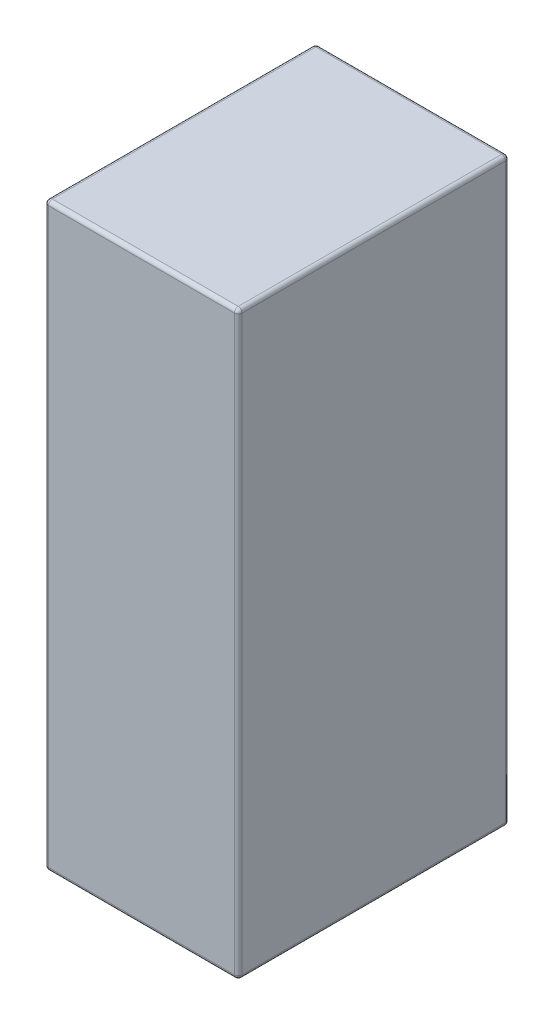
ISO-10303-21;
HEADER;
FILE_DESCRIPTION(('STEP AP214'),'2;1');
FILE_NAME('part.step','',(''),(''),'','','');
FILE_SCHEMA(('AUTOMOTIVE_DESIGN { 1 0 10303 214 1 1 1 1 }'));
ENDSEC;
DATA;
#1=APPLICATION_CONTEXT('core data for automotive mechanical design processes');
#2=APPLICATION_PROTOCOL_DEFINITION('international standard','automotive_design',2000,#1);
#3=PRODUCT_CONTEXT('',#1,'mechanical');
#4=PRODUCT('Part','Part','',(#3));
#5=PRODUCT_RELATED_PRODUCT_CATEGORY('part','',(#4));
#6=PRODUCT_DEFINITION_FORMATION('','',#4);
#7=PRODUCT_DEFINITION_CONTEXT('part definition',#1,'design');
#8=PRODUCT_DEFINITION('design','',#6,#7);
#9=PRODUCT_DEFINITION_SHAPE('','',#8);
#10=(LENGTH_UNIT() NAMED_UNIT(*) SI_UNIT(.MILLI.,.METRE.));
#11=(NAMED_UNIT(*) PLANE_ANGLE_UNIT() SI_UNIT($,.RADIAN.));
#12=(NAMED_UNIT(*) SI_UNIT($,.STERADIAN.) SOLID_ANGLE_UNIT());
#13=UNCERTAINTY_MEASURE_WITH_UNIT(LENGTH_MEASURE(1.E-05),#10,'distance_accuracy_value','');
#14=(GEOMETRIC_REPRESENTATION_CONTEXT(3) GLOBAL_UNCERTAINTY_ASSIGNED_CONTEXT((#13)) GLOBAL_UNIT_ASSIGNED_CONTEXT((#10,
#11,#12)) REPRESENTATION_CONTEXT('',''));
#15=CARTESIAN_POINT('',(0.,0.,0.));
#16=DIRECTION('',(0.,0.,1.));
#17=DIRECTION('',(1.,0.,0.));
#18=AXIS2_PLACEMENT_3D('',#15,#16,#17);
#19=CARTESIAN_POINT('',(25.,75.,35.));
#20=DIRECTION('',(-1.,0.,0.));
#21=DIRECTION('',(0.,0.,1.));
#22=AXIS2_PLACEMENT_3D('',#19,#20,#21);
#23=PLANE('',#22);
#24=DIRECTION('',(0.,-1.,0.));
#25=VECTOR('',#24,1.);
#26=CARTESIAN_POINT('',(25.,75.,34.));
#27=LINE('',#26,#25);
#28=CARTESIAN_POINT('',(25.,74.,34.));
#29=VERTEX_POINT('',#28);
#30=CARTESIAN_POINT('',(25.,-74.,34.));
#31=VERTEX_POINT('',#30);
#32=EDGE_CURVE('E165',#29,#31,#27,.T.);
#33=ORIENTED_EDGE('',*,*,#32,.T.);
#34=DIRECTION('',(0.,0.,-1.));
#35=VECTOR('',#34,1.);
#36=CARTESIAN_POINT('',(25.,-74.,-35.));
#37=LINE('',#36,#35);
#38=CARTESIAN_POINT('',(25.,-74.,-34.));
#39=VERTEX_POINT('',#38);
#40=EDGE_CURVE('E170',#31,#39,#37,.T.);
#41=ORIENTED_EDGE('',*,*,#40,.T.);
#42=DIRECTION('',(0.,-1.,0.));
#43=VECTOR('',#42,1.);
#44=CARTESIAN_POINT('',(25.,75.,-34.));
#45=LINE('',#44,#43);
#46=CARTESIAN_POINT('',(25.,74.,-34.));
#47=VERTEX_POINT('',#46);
#48=EDGE_CURVE('E167',#39,#47,#45,.F.);
#49=ORIENTED_EDGE('',*,*,#48,.T.);
#50=DIRECTION('',(0.,0.,-1.));
#51=VECTOR('',#50,1.);
#52=CARTESIAN_POINT('',(25.,74.,35.));
#53=LINE('',#52,#51);
#54=EDGE_CURVE('E163',#47,#29,#53,.F.);
#55=ORIENTED_EDGE('',*,*,#54,.T.);
#56=EDGE_LOOP('',(#33,#41,#49,#55));
#57=FACE_BOUND('',#56,.T.);
#58=ADVANCED_FACE('F32',(#57),#23,.F.);
#59=CARTESIAN_POINT('',(-25.,75.,-35.));
#60=DIRECTION('',(0.,0.,1.));
#61=DIRECTION('',(1.,0.,0.));
#62=AXIS2_PLACEMENT_3D('',#59,#60,#61);
#63=PLANE('',#62);
#64=DIRECTION('',(0.,-1.,0.));
#65=VECTOR('',#64,1.);
#66=CARTESIAN_POINT('',(24.,75.,-35.));
#67=LINE('',#66,#65);
#68=CARTESIAN_POINT('',(24.,74.,-35.));
#69=VERTEX_POINT('',#68);
#70=CARTESIAN_POINT('',(24.,-74.,-35.));
#71=VERTEX_POINT('',#70);
#72=EDGE_CURVE('E131',#69,#71,#67,.T.);
#73=ORIENTED_EDGE('',*,*,#72,.T.);
#74=DIRECTION('',(-1.,0.,0.));
#75=VECTOR('',#74,1.);
#76=CARTESIAN_POINT('',(-25.,-74.,-35.));
#77=LINE('',#76,#75);
#78=CARTESIAN_POINT('',(-24.,-74.,-35.));
#79=VERTEX_POINT('',#78);
#80=EDGE_CURVE('E127',#71,#79,#77,.T.);
#81=ORIENTED_EDGE('',*,*,#80,.T.);
#82=DIRECTION('',(0.,-1.,0.));
#83=VECTOR('',#82,1.);
#84=CARTESIAN_POINT('',(-24.,75.,-35.));
#85=LINE('',#84,#83);
#86=CARTESIAN_POINT('',(-24.,74.,-35.));
#87=VERTEX_POINT('',#86);
#88=EDGE_CURVE('E119',#79,#87,#85,.F.);
#89=ORIENTED_EDGE('',*,*,#88,.T.);
#90=DIRECTION('',(-1.,0.,0.));
#91=VECTOR('',#90,1.);
#92=CARTESIAN_POINT('',(-25.,74.,-35.));
#93=LINE('',#92,#91);
#94=EDGE_CURVE('E124',#87,#69,#93,.F.);
#95=ORIENTED_EDGE('',*,*,#94,.T.);
#96=EDGE_LOOP('',(#73,#81,#89,#95));
#97=FACE_BOUND('',#96,.T.);
#98=ADVANCED_FACE('F122',(#97),#63,.F.);
#99=CARTESIAN_POINT('',(-25.,75.,35.));
#100=DIRECTION('',(1.,0.,0.));
#101=DIRECTION('',(0.,0.,-1.));
#102=AXIS2_PLACEMENT_3D('',#99,#100,#101);
#103=PLANE('',#102);
#104=DIRECTION('',(0.,-1.,0.));
#105=VECTOR('',#104,1.);
#106=CARTESIAN_POINT('',(-25.,75.,-34.));
#107=LINE('',#106,#105);
#108=CARTESIAN_POINT('',(-25.,74.,-34.));
#109=VERTEX_POINT('',#108);
#110=CARTESIAN_POINT('',(-25.,-74.,-34.));
#111=VERTEX_POINT('',#110);
#112=EDGE_CURVE('E139',#109,#111,#107,.T.);
#113=ORIENTED_EDGE('',*,*,#112,.T.);
#114=DIRECTION('',(0.,0.,1.));
#115=VECTOR('',#114,1.);
#116=CARTESIAN_POINT('',(-25.,-74.,35.));
#117=LINE('',#116,#115);
#118=CARTESIAN_POINT('',(-25.,-74.,34.));
#119=VERTEX_POINT('',#118);
#120=EDGE_CURVE('E177',#111,#119,#117,.T.);
#121=ORIENTED_EDGE('',*,*,#120,.T.);
#122=DIRECTION('',(0.,-1.,0.));
#123=VECTOR('',#122,1.);
#124=CARTESIAN_POINT('',(-25.,75.,34.));
#125=LINE('',#124,#123);
#126=CARTESIAN_POINT('',(-25.,74.,34.));
#127=VERTEX_POINT('',#126);
#128=EDGE_CURVE('E174',#119,#127,#125,.F.);
#129=ORIENTED_EDGE('',*,*,#128,.T.);
#130=DIRECTION('',(0.,0.,1.));
#131=VECTOR('',#130,1.);
#132=CARTESIAN_POINT('',(-25.,74.,35.));
#133=LINE('',#132,#131);
#134=EDGE_CURVE('E172',#127,#109,#133,.F.);
#135=ORIENTED_EDGE('',*,*,#134,.T.);
#136=EDGE_LOOP('',(#113,#121,#129,#135));
#137=FACE_BOUND('',#136,.T.);
#138=ADVANCED_FACE('F323',(#137),#103,.F.);
#139=CARTESIAN_POINT('',(-25.,75.,35.));
#140=DIRECTION('',(0.,0.,-1.));
#141=DIRECTION('',(-1.,0.,0.));
#142=AXIS2_PLACEMENT_3D('',#139,#140,#141);
#143=PLANE('',#142);
#144=DIRECTION('',(0.,-1.,0.));
#145=VECTOR('',#144,1.);
#146=CARTESIAN_POINT('',(-24.,75.,35.));
#147=LINE('',#146,#145);
#148=CARTESIAN_POINT('',(-24.,74.,35.));
#149=VERTEX_POINT('',#148);
#150=CARTESIAN_POINT('',(-24.,-74.,35.));
#151=VERTEX_POINT('',#150);
#152=EDGE_CURVE('E183',#149,#151,#147,.T.);
#153=ORIENTED_EDGE('',*,*,#152,.T.);
#154=DIRECTION('',(1.,0.,0.));
#155=VECTOR('',#154,1.);
#156=CARTESIAN_POINT('',(25.,-74.,35.));
#157=LINE('',#156,#155);
#158=CARTESIAN_POINT('',(24.,-74.,35.));
#159=VERTEX_POINT('',#158);
#160=EDGE_CURVE('E186',#151,#159,#157,.T.);
#161=ORIENTED_EDGE('',*,*,#160,.T.);
#162=DIRECTION('',(0.,-1.,0.));
#163=VECTOR('',#162,1.);
#164=CARTESIAN_POINT('',(24.,75.,35.));
#165=LINE('',#164,#163);
#166=CARTESIAN_POINT('',(24.,74.,35.));
#167=VERTEX_POINT('',#166);
#168=EDGE_CURVE('E181',#159,#167,#165,.F.);
#169=ORIENTED_EDGE('',*,*,#168,.T.);
#170=DIRECTION('',(1.,0.,0.));
#171=VECTOR('',#170,1.);
#172=CARTESIAN_POINT('',(-25.,74.,35.));
#173=LINE('',#172,#171);
#174=EDGE_CURVE('E179',#167,#149,#173,.F.);
#175=ORIENTED_EDGE('',*,*,#174,.T.);
#176=EDGE_LOOP('',(#153,#161,#169,#175));
#177=FACE_BOUND('',#176,.T.);
#178=ADVANCED_FACE('F272',(#177),#143,.F.);
#179=CARTESIAN_POINT('',(0.,75.,0.));
#180=DIRECTION('',(0.,-1.,0.));
#181=DIRECTION('',(0.,0.,-1.));
#182=AXIS2_PLACEMENT_3D('',#179,#180,#181);
#183=PLANE('',#182);
#184=DIRECTION('',(0.,0.,1.));
#185=VECTOR('',#184,1.);
#186=CARTESIAN_POINT('',(-24.,75.,0.));
#187=LINE('',#186,#185);
#188=CARTESIAN_POINT('',(-24.,75.,-34.));
#189=VERTEX_POINT('',#188);
#190=CARTESIAN_POINT('',(-24.,75.,34.));
#191=VERTEX_POINT('',#190);
#192=EDGE_CURVE('E41',#189,#191,#187,.T.);
#193=ORIENTED_EDGE('',*,*,#192,.T.);
#194=DIRECTION('',(1.,0.,0.));
#195=VECTOR('',#194,1.);
#196=CARTESIAN_POINT('',(0.,75.,34.));
#197=LINE('',#196,#195);
#198=CARTESIAN_POINT('',(24.,75.,34.));
#199=VERTEX_POINT('',#198);
#200=EDGE_CURVE('E11',#191,#199,#197,.T.);
#201=ORIENTED_EDGE('',*,*,#200,.T.);
#202=DIRECTION('',(0.,0.,-1.));
#203=VECTOR('',#202,1.);
#204=CARTESIAN_POINT('',(24.,75.,0.));
#205=LINE('',#204,#203);
#206=CARTESIAN_POINT('',(24.,75.,-34.));
#207=VERTEX_POINT('',#206);
#208=EDGE_CURVE('E197',#199,#207,#205,.T.);
#209=ORIENTED_EDGE('',*,*,#208,.T.);
#210=DIRECTION('',(-1.,0.,0.));
#211=VECTOR('',#210,1.);
#212=CARTESIAN_POINT('',(0.,75.,-34.));
#213=LINE('',#212,#211);
#214=EDGE_CURVE('E52',#207,#189,#213,.T.);
#215=ORIENTED_EDGE('',*,*,#214,.T.);
#216=EDGE_LOOP('',(#193,#201,#209,#215));
#217=FACE_BOUND('',#216,.T.);
#218=ADVANCED_FACE('F287',(#217),#183,.F.);
#219=CARTESIAN_POINT('',(0.,-75.,0.));
#220=DIRECTION('',(0.,-1.,0.));
#221=DIRECTION('',(0.,0.,-1.));
#222=AXIS2_PLACEMENT_3D('',#219,#220,#221);
#223=PLANE('',#222);
#224=DIRECTION('',(0.,0.,1.));
#225=VECTOR('',#224,1.);
#226=CARTESIAN_POINT('',(-24.,-75.,-35.));
#227=LINE('',#226,#225);
#228=CARTESIAN_POINT('',(-24.,-75.,34.));
#229=VERTEX_POINT('',#228);
#230=CARTESIAN_POINT('',(-24.,-75.,-34.));
#231=VERTEX_POINT('',#230);
#232=EDGE_CURVE('E192',#229,#231,#227,.F.);
#233=ORIENTED_EDGE('',*,*,#232,.T.);
#234=DIRECTION('',(-1.,0.,0.));
#235=VECTOR('',#234,1.);
#236=CARTESIAN_POINT('',(25.,-75.,-34.));
#237=LINE('',#236,#235);
#238=CARTESIAN_POINT('',(24.,-75.,-34.));
#239=VERTEX_POINT('',#238);
#240=EDGE_CURVE('E194',#231,#239,#237,.F.);
#241=ORIENTED_EDGE('',*,*,#240,.T.);
#242=DIRECTION('',(0.,0.,-1.));
#243=VECTOR('',#242,1.);
#244=CARTESIAN_POINT('',(24.,-75.,35.));
#245=LINE('',#244,#243);
#246=CARTESIAN_POINT('',(24.,-75.,34.));
#247=VERTEX_POINT('',#246);
#248=EDGE_CURVE('E188',#239,#247,#245,.F.);
#249=ORIENTED_EDGE('',*,*,#248,.T.);
#250=DIRECTION('',(1.,0.,0.));
#251=VECTOR('',#250,1.);
#252=CARTESIAN_POINT('',(-25.,-75.,34.));
#253=LINE('',#252,#251);
#254=EDGE_CURVE('E190',#247,#229,#253,.F.);
#255=ORIENTED_EDGE('',*,*,#254,.T.);
#256=EDGE_LOOP('',(#233,#241,#249,#255));
#257=FACE_BOUND('',#256,.T.);
#258=ADVANCED_FACE('F263',(#257),#223,.T.);
#259=CARTESIAN_POINT('',(-24.,75.,34.));
#260=DIRECTION('',(0.,-1.,0.));
#261=DIRECTION('',(0.,0.,-1.));
#262=AXIS2_PLACEMENT_3D('',#259,#260,#261);
#263=CYLINDRICAL_SURFACE('',#262,1.);
#264=CARTESIAN_POINT('',(-24.,74.,34.));
#265=DIRECTION('',(0.,1.,0.));
#266=DIRECTION('',(0.,0.,1.));
#267=AXIS2_PLACEMENT_3D('',#264,#265,#266);
#268=CIRCLE('',#267,1.);
#269=EDGE_CURVE('E36',#127,#149,#268,.T.);
#270=ORIENTED_EDGE('',*,*,#269,.F.);
#271=ORIENTED_EDGE('',*,*,#128,.F.);
#272=CARTESIAN_POINT('',(-24.,-74.,34.));
#273=DIRECTION('',(0.,-1.,0.));
#274=DIRECTION('',(0.,0.,-1.));
#275=AXIS2_PLACEMENT_3D('',#272,#273,#274);
#276=CIRCLE('',#275,1.);
#277=EDGE_CURVE('E159',#151,#119,#276,.T.);
#278=ORIENTED_EDGE('',*,*,#277,.F.);
#279=ORIENTED_EDGE('',*,*,#152,.F.);
#280=EDGE_LOOP('',(#270,#271,#278,#279));
#281=FACE_BOUND('',#280,.T.);
#282=ADVANCED_FACE('F34',(#281),#263,.T.);
#283=CARTESIAN_POINT('',(-24.,74.,34.));
#284=DIRECTION('',(0.,0.,1.));
#285=DIRECTION('',(1.,0.,0.));
#286=AXIS2_PLACEMENT_3D('',#283,#284,#285);
#287=SPHERICAL_SURFACE('',#286,1.);
#288=CARTESIAN_POINT('',(-24.,74.,34.));
#289=DIRECTION('',(0.,0.,1.));
#290=DIRECTION('',(1.,0.,0.));
#291=AXIS2_PLACEMENT_3D('',#288,#289,#290);
#292=CIRCLE('',#291,1.);
#293=EDGE_CURVE('E243',#127,#191,#292,.F.);
#294=ORIENTED_EDGE('',*,*,#293,.F.);
#295=ORIENTED_EDGE('',*,*,#269,.T.);
#296=CARTESIAN_POINT('',(-24.,74.,34.));
#297=DIRECTION('',(-1.,0.,0.));
#298=DIRECTION('',(0.,0.,1.));
#299=AXIS2_PLACEMENT_3D('',#296,#297,#298);
#300=CIRCLE('',#299,1.);
#301=EDGE_CURVE('E245',#191,#149,#300,.F.);
#302=ORIENTED_EDGE('',*,*,#301,.F.);
#303=EDGE_LOOP('',(#294,#295,#302));
#304=FACE_BOUND('',#303,.T.);
#305=ADVANCED_FACE('F456',(#304),#287,.T.);
#306=CARTESIAN_POINT('',(-24.,-74.,34.));
#307=DIRECTION('',(0.,0.,1.));
#308=DIRECTION('',(1.,0.,0.));
#309=AXIS2_PLACEMENT_3D('',#306,#307,#308);
#310=SPHERICAL_SURFACE('',#309,1.);
#311=CARTESIAN_POINT('',(-24.,-74.,34.));
#312=DIRECTION('',(-1.,0.,0.));
#313=DIRECTION('',(0.,0.,1.));
#314=AXIS2_PLACEMENT_3D('',#311,#312,#313);
#315=CIRCLE('',#314,1.);
#316=EDGE_CURVE('E237',#151,#229,#315,.F.);
#317=ORIENTED_EDGE('',*,*,#316,.F.);
#318=ORIENTED_EDGE('',*,*,#277,.T.);
#319=CARTESIAN_POINT('',(-24.,-74.,34.));
#320=DIRECTION('',(0.,0.,1.));
#321=DIRECTION('',(1.,0.,0.));
#322=AXIS2_PLACEMENT_3D('',#319,#320,#321);
#323=CIRCLE('',#322,1.);
#324=EDGE_CURVE('E240',#229,#119,#323,.F.);
#325=ORIENTED_EDGE('',*,*,#324,.F.);
#326=EDGE_LOOP('',(#317,#318,#325));
#327=FACE_BOUND('',#326,.T.);
#328=ADVANCED_FACE('F252',(#327),#310,.T.);
#329=CARTESIAN_POINT('',(0.,74.,34.));
#330=DIRECTION('',(1.,0.,0.));
#331=DIRECTION('',(0.,0.,-1.));
#332=AXIS2_PLACEMENT_3D('',#329,#330,#331);
#333=CYLINDRICAL_SURFACE('',#332,1.);
#334=ORIENTED_EDGE('',*,*,#301,.T.);
#335=ORIENTED_EDGE('',*,*,#174,.F.);
#336=CARTESIAN_POINT('',(24.,74.,34.));
#337=DIRECTION('',(1.,0.,0.));
#338=DIRECTION('',(0.,0.,-1.));
#339=AXIS2_PLACEMENT_3D('',#336,#337,#338);
#340=CIRCLE('',#339,1.);
#341=EDGE_CURVE('E231',#199,#167,#340,.T.);
#342=ORIENTED_EDGE('',*,*,#341,.F.);
#343=ORIENTED_EDGE('',*,*,#200,.F.);
#344=EDGE_LOOP('',(#334,#335,#342,#343));
#345=FACE_BOUND('',#344,.T.);
#346=ADVANCED_FACE('F286',(#345),#333,.T.);
#347=CARTESIAN_POINT('',(-24.,74.,0.));
#348=DIRECTION('',(0.,0.,1.));
#349=DIRECTION('',(1.,0.,0.));
#350=AXIS2_PLACEMENT_3D('',#347,#348,#349);
#351=CYLINDRICAL_SURFACE('',#350,1.);
#352=ORIENTED_EDGE('',*,*,#293,.T.);
#353=ORIENTED_EDGE('',*,*,#192,.F.);
#354=CARTESIAN_POINT('',(-24.,74.,-34.));
#355=DIRECTION('',(0.,0.,-1.));
#356=DIRECTION('',(-1.,0.,0.));
#357=AXIS2_PLACEMENT_3D('',#354,#355,#356);
#358=CIRCLE('',#357,1.);
#359=EDGE_CURVE('E143',#109,#189,#358,.T.);
#360=ORIENTED_EDGE('',*,*,#359,.F.);
#361=ORIENTED_EDGE('',*,*,#134,.F.);
#362=EDGE_LOOP('',(#352,#353,#360,#361));
#363=FACE_BOUND('',#362,.T.);
#364=ADVANCED_FACE('F433',(#363),#351,.T.);
#365=CARTESIAN_POINT('',(-24.,75.,-34.));
#366=DIRECTION('',(0.,-1.,0.));
#367=DIRECTION('',(0.,0.,-1.));
#368=AXIS2_PLACEMENT_3D('',#365,#366,#367);
#369=CYLINDRICAL_SURFACE('',#368,1.);
#370=CARTESIAN_POINT('',(-24.,-74.,-34.));
#371=DIRECTION('',(0.,-1.,0.));
#372=DIRECTION('',(0.,0.,-1.));
#373=AXIS2_PLACEMENT_3D('',#370,#371,#372);
#374=CIRCLE('',#373,1.);
#375=EDGE_CURVE('E144',#111,#79,#374,.T.);
#376=ORIENTED_EDGE('',*,*,#375,.F.);
#377=ORIENTED_EDGE('',*,*,#112,.F.);
#378=CARTESIAN_POINT('',(-24.,74.,-34.));
#379=DIRECTION('',(0.,1.,0.));
#380=DIRECTION('',(0.,0.,1.));
#381=AXIS2_PLACEMENT_3D('',#378,#379,#380);
#382=CIRCLE('',#381,1.);
#383=EDGE_CURVE('E135',#87,#109,#382,.T.);
#384=ORIENTED_EDGE('',*,*,#383,.F.);
#385=ORIENTED_EDGE('',*,*,#88,.F.);
#386=EDGE_LOOP('',(#376,#377,#384,#385));
#387=FACE_BOUND('',#386,.T.);
#388=ADVANCED_FACE('F137',(#387),#369,.T.);
#389=CARTESIAN_POINT('',(-24.,-74.,35.));
#390=DIRECTION('',(0.,0.,-1.));
#391=DIRECTION('',(-1.,0.,0.));
#392=AXIS2_PLACEMENT_3D('',#389,#390,#391);
#393=CYLINDRICAL_SURFACE('',#392,1.);
#394=ORIENTED_EDGE('',*,*,#324,.T.);
#395=ORIENTED_EDGE('',*,*,#120,.F.);
#396=CARTESIAN_POINT('',(-24.,-74.,-34.));
#397=DIRECTION('',(0.,0.,-1.));
#398=DIRECTION('',(-1.,0.,0.));
#399=AXIS2_PLACEMENT_3D('',#396,#397,#398);
#400=CIRCLE('',#399,1.);
#401=EDGE_CURVE('E227',#231,#111,#400,.T.);
#402=ORIENTED_EDGE('',*,*,#401,.F.);
#403=ORIENTED_EDGE('',*,*,#232,.F.);
#404=EDGE_LOOP('',(#394,#395,#402,#403));
#405=FACE_BOUND('',#404,.T.);
#406=ADVANCED_FACE('F259',(#405),#393,.T.);
#407=CARTESIAN_POINT('',(-25.,-74.,34.));
#408=DIRECTION('',(-1.,0.,0.));
#409=DIRECTION('',(0.,0.,1.));
#410=AXIS2_PLACEMENT_3D('',#407,#408,#409);
#411=CYLINDRICAL_SURFACE('',#410,1.);
#412=ORIENTED_EDGE('',*,*,#316,.T.);
#413=ORIENTED_EDGE('',*,*,#254,.F.);
#414=CARTESIAN_POINT('',(24.,-74.,34.));
#415=DIRECTION('',(1.,0.,0.));
#416=DIRECTION('',(0.,0.,-1.));
#417=AXIS2_PLACEMENT_3D('',#414,#415,#416);
#418=CIRCLE('',#417,1.);
#419=EDGE_CURVE('E224',#159,#247,#418,.T.);
#420=ORIENTED_EDGE('',*,*,#419,.F.);
#421=ORIENTED_EDGE('',*,*,#160,.F.);
#422=EDGE_LOOP('',(#412,#413,#420,#421));
#423=FACE_BOUND('',#422,.T.);
#424=ADVANCED_FACE('F269',(#423),#411,.T.);
#425=CARTESIAN_POINT('',(24.,75.,34.));
#426=DIRECTION('',(0.,-1.,0.));
#427=DIRECTION('',(0.,0.,-1.));
#428=AXIS2_PLACEMENT_3D('',#425,#426,#427);
#429=CYLINDRICAL_SURFACE('',#428,1.);
#430=CARTESIAN_POINT('',(24.,74.,34.));
#431=DIRECTION('',(0.,1.,0.));
#432=DIRECTION('',(0.,0.,1.));
#433=AXIS2_PLACEMENT_3D('',#430,#431,#432);
#434=CIRCLE('',#433,1.);
#435=EDGE_CURVE('E234',#167,#29,#434,.T.);
#436=ORIENTED_EDGE('',*,*,#435,.F.);
#437=ORIENTED_EDGE('',*,*,#168,.F.);
#438=CARTESIAN_POINT('',(24.,-74.,34.));
#439=DIRECTION('',(0.,-1.,0.));
#440=DIRECTION('',(0.,0.,-1.));
#441=AXIS2_PLACEMENT_3D('',#438,#439,#440);
#442=CIRCLE('',#441,1.);
#443=EDGE_CURVE('E221',#31,#159,#442,.T.);
#444=ORIENTED_EDGE('',*,*,#443,.F.);
#445=ORIENTED_EDGE('',*,*,#32,.F.);
#446=EDGE_LOOP('',(#436,#437,#444,#445));
#447=FACE_BOUND('',#446,.T.);
#448=ADVANCED_FACE('F277',(#447),#429,.T.);
#449=CARTESIAN_POINT('',(24.,74.,34.));
#450=DIRECTION('',(0.,0.,1.));
#451=DIRECTION('',(1.,0.,0.));
#452=AXIS2_PLACEMENT_3D('',#449,#450,#451);
#453=SPHERICAL_SURFACE('',#452,1.);
#454=ORIENTED_EDGE('',*,*,#341,.T.);
#455=ORIENTED_EDGE('',*,*,#435,.T.);
#456=CARTESIAN_POINT('',(24.,74.,34.));
#457=DIRECTION('',(0.,0.,1.));
#458=DIRECTION('',(1.,0.,0.));
#459=AXIS2_PLACEMENT_3D('',#456,#457,#458);
#460=CIRCLE('',#459,1.);
#461=EDGE_CURVE('E150',#199,#29,#460,.F.);
#462=ORIENTED_EDGE('',*,*,#461,.F.);
#463=EDGE_LOOP('',(#454,#455,#462));
#464=FACE_BOUND('',#463,.T.);
#465=ADVANCED_FACE('F283',(#464),#453,.T.);
#466=CARTESIAN_POINT('',(-24.,74.,-34.));
#467=DIRECTION('',(0.,0.,1.));
#468=DIRECTION('',(1.,0.,0.));
#469=AXIS2_PLACEMENT_3D('',#466,#467,#468);
#470=SPHERICAL_SURFACE('',#469,1.);
#471=ORIENTED_EDGE('',*,*,#383,.T.);
#472=ORIENTED_EDGE('',*,*,#359,.T.);
#473=CARTESIAN_POINT('',(-24.,74.,-34.));
#474=DIRECTION('',(-1.,0.,0.));
#475=DIRECTION('',(0.,0.,1.));
#476=AXIS2_PLACEMENT_3D('',#473,#474,#475);
#477=CIRCLE('',#476,1.);
#478=EDGE_CURVE('E147',#87,#189,#477,.F.);
#479=ORIENTED_EDGE('',*,*,#478,.F.);
#480=EDGE_LOOP('',(#471,#472,#479));
#481=FACE_BOUND('',#480,.T.);
#482=ADVANCED_FACE('F148',(#481),#470,.T.);
#483=CARTESIAN_POINT('',(-24.,-74.,-34.));
#484=DIRECTION('',(0.,0.,1.));
#485=DIRECTION('',(1.,0.,0.));
#486=AXIS2_PLACEMENT_3D('',#483,#484,#485);
#487=SPHERICAL_SURFACE('',#486,1.);
#488=ORIENTED_EDGE('',*,*,#401,.T.);
#489=ORIENTED_EDGE('',*,*,#375,.T.);
#490=CARTESIAN_POINT('',(-24.,-74.,-34.));
#491=DIRECTION('',(-1.,0.,0.));
#492=DIRECTION('',(0.,0.,1.));
#493=AXIS2_PLACEMENT_3D('',#490,#491,#492);
#494=CIRCLE('',#493,1.);
#495=EDGE_CURVE('E151',#231,#79,#494,.F.);
#496=ORIENTED_EDGE('',*,*,#495,.F.);
#497=EDGE_LOOP('',(#488,#489,#496));
#498=FACE_BOUND('',#497,.T.);
#499=ADVANCED_FACE('F306',(#498),#487,.T.);
#500=CARTESIAN_POINT('',(24.,-74.,34.));
#501=DIRECTION('',(0.,0.,1.));
#502=DIRECTION('',(1.,0.,0.));
#503=AXIS2_PLACEMENT_3D('',#500,#501,#502);
#504=SPHERICAL_SURFACE('',#503,1.);
#505=ORIENTED_EDGE('',*,*,#443,.T.);
#506=ORIENTED_EDGE('',*,*,#419,.T.);
#507=CARTESIAN_POINT('',(24.,-74.,34.));
#508=DIRECTION('',(0.,0.,1.));
#509=DIRECTION('',(1.,0.,0.));
#510=AXIS2_PLACEMENT_3D('',#507,#508,#509);
#511=CIRCLE('',#510,1.);
#512=EDGE_CURVE('E214',#31,#247,#511,.F.);
#513=ORIENTED_EDGE('',*,*,#512,.F.);
#514=EDGE_LOOP('',(#505,#506,#513));
#515=FACE_BOUND('',#514,.T.);
#516=ADVANCED_FACE('F308',(#515),#504,.T.);
#517=CARTESIAN_POINT('',(24.,74.,0.));
#518=DIRECTION('',(0.,0.,-1.));
#519=DIRECTION('',(-1.,0.,0.));
#520=AXIS2_PLACEMENT_3D('',#517,#518,#519);
#521=CYLINDRICAL_SURFACE('',#520,1.);
#522=ORIENTED_EDGE('',*,*,#461,.T.);
#523=ORIENTED_EDGE('',*,*,#54,.F.);
#524=CARTESIAN_POINT('',(24.,74.,-34.));
#525=DIRECTION('',(0.,0.,-1.));
#526=DIRECTION('',(-1.,0.,0.));
#527=AXIS2_PLACEMENT_3D('',#524,#525,#526);
#528=CIRCLE('',#527,1.);
#529=EDGE_CURVE('E211',#207,#47,#528,.T.);
#530=ORIENTED_EDGE('',*,*,#529,.F.);
#531=ORIENTED_EDGE('',*,*,#208,.F.);
#532=EDGE_LOOP('',(#522,#523,#530,#531));
#533=FACE_BOUND('',#532,.T.);
#534=ADVANCED_FACE('F291',(#533),#521,.T.);
#535=CARTESIAN_POINT('',(0.,74.,-34.));
#536=DIRECTION('',(-1.,0.,0.));
#537=DIRECTION('',(0.,0.,1.));
#538=AXIS2_PLACEMENT_3D('',#535,#536,#537);
#539=CYLINDRICAL_SURFACE('',#538,1.);
#540=ORIENTED_EDGE('',*,*,#478,.T.);
#541=ORIENTED_EDGE('',*,*,#214,.F.);
#542=CARTESIAN_POINT('',(24.,74.,-34.));
#543=DIRECTION('',(1.,0.,0.));
#544=DIRECTION('',(0.,0.,-1.));
#545=AXIS2_PLACEMENT_3D('',#542,#543,#544);
#546=CIRCLE('',#545,1.);
#547=EDGE_CURVE('E155',#69,#207,#546,.T.);
#548=ORIENTED_EDGE('',*,*,#547,.F.);
#549=ORIENTED_EDGE('',*,*,#94,.F.);
#550=EDGE_LOOP('',(#540,#541,#548,#549));
#551=FACE_BOUND('',#550,.T.);
#552=ADVANCED_FACE('F153',(#551),#539,.T.);
#553=CARTESIAN_POINT('',(-25.,-74.,-34.));
#554=DIRECTION('',(1.,0.,0.));
#555=DIRECTION('',(0.,0.,-1.));
#556=AXIS2_PLACEMENT_3D('',#553,#554,#555);
#557=CYLINDRICAL_SURFACE('',#556,1.);
#558=ORIENTED_EDGE('',*,*,#495,.T.);
#559=ORIENTED_EDGE('',*,*,#80,.F.);
#560=CARTESIAN_POINT('',(24.,-74.,-34.));
#561=DIRECTION('',(1.,0.,0.));
#562=DIRECTION('',(0.,0.,-1.));
#563=AXIS2_PLACEMENT_3D('',#560,#561,#562);
#564=CIRCLE('',#563,1.);
#565=EDGE_CURVE('E207',#239,#71,#564,.T.);
#566=ORIENTED_EDGE('',*,*,#565,.F.);
#567=ORIENTED_EDGE('',*,*,#240,.F.);
#568=EDGE_LOOP('',(#558,#559,#566,#567));
#569=FACE_BOUND('',#568,.T.);
#570=ADVANCED_FACE('F304',(#569),#557,.T.);
#571=CARTESIAN_POINT('',(24.,-74.,35.));
#572=DIRECTION('',(0.,0.,1.));
#573=DIRECTION('',(1.,0.,0.));
#574=AXIS2_PLACEMENT_3D('',#571,#572,#573);
#575=CYLINDRICAL_SURFACE('',#574,1.);
#576=ORIENTED_EDGE('',*,*,#512,.T.);
#577=ORIENTED_EDGE('',*,*,#248,.F.);
#578=CARTESIAN_POINT('',(24.,-74.,-34.));
#579=DIRECTION('',(0.,0.,-1.));
#580=DIRECTION('',(-1.,0.,0.));
#581=AXIS2_PLACEMENT_3D('',#578,#579,#580);
#582=CIRCLE('',#581,1.);
#583=EDGE_CURVE('E205',#39,#239,#582,.T.);
#584=ORIENTED_EDGE('',*,*,#583,.F.);
#585=ORIENTED_EDGE('',*,*,#40,.F.);
#586=EDGE_LOOP('',(#576,#577,#584,#585));
#587=FACE_BOUND('',#586,.T.);
#588=ADVANCED_FACE('F333',(#587),#575,.T.);
#589=CARTESIAN_POINT('',(24.,74.,-34.));
#590=DIRECTION('',(0.,0.,1.));
#591=DIRECTION('',(1.,0.,0.));
#592=AXIS2_PLACEMENT_3D('',#589,#590,#591);
#593=SPHERICAL_SURFACE('',#592,1.);
#594=ORIENTED_EDGE('',*,*,#547,.T.);
#595=ORIENTED_EDGE('',*,*,#529,.T.);
#596=CARTESIAN_POINT('',(24.,74.,-34.));
#597=DIRECTION('',(0.,1.,0.));
#598=DIRECTION('',(0.,0.,1.));
#599=AXIS2_PLACEMENT_3D('',#596,#597,#598);
#600=CIRCLE('',#599,1.);
#601=EDGE_CURVE('E203',#69,#47,#600,.F.);
#602=ORIENTED_EDGE('',*,*,#601,.F.);
#603=EDGE_LOOP('',(#594,#595,#602));
#604=FACE_BOUND('',#603,.T.);
#605=ADVANCED_FACE('F293',(#604),#593,.T.);
#606=CARTESIAN_POINT('',(24.,-74.,-34.));
#607=DIRECTION('',(0.,0.,1.));
#608=DIRECTION('',(1.,0.,0.));
#609=AXIS2_PLACEMENT_3D('',#606,#607,#608);
#610=SPHERICAL_SURFACE('',#609,1.);
#611=ORIENTED_EDGE('',*,*,#583,.T.);
#612=ORIENTED_EDGE('',*,*,#565,.T.);
#613=CARTESIAN_POINT('',(24.,-74.,-34.));
#614=DIRECTION('',(0.,-1.,0.));
#615=DIRECTION('',(0.,0.,-1.));
#616=AXIS2_PLACEMENT_3D('',#613,#614,#615);
#617=CIRCLE('',#616,1.);
#618=EDGE_CURVE('E201',#39,#71,#617,.F.);
#619=ORIENTED_EDGE('',*,*,#618,.F.);
#620=EDGE_LOOP('',(#611,#612,#619));
#621=FACE_BOUND('',#620,.T.);
#622=ADVANCED_FACE('F301',(#621),#610,.T.);
#623=CARTESIAN_POINT('',(24.,75.,-34.));
#624=DIRECTION('',(0.,-1.,0.));
#625=DIRECTION('',(0.,0.,-1.));
#626=AXIS2_PLACEMENT_3D('',#623,#624,#625);
#627=CYLINDRICAL_SURFACE('',#626,1.);
#628=ORIENTED_EDGE('',*,*,#601,.T.);
#629=ORIENTED_EDGE('',*,*,#48,.F.);
#630=ORIENTED_EDGE('',*,*,#618,.T.);
#631=ORIENTED_EDGE('',*,*,#72,.F.);
#632=EDGE_LOOP('',(#628,#629,#630,#631));
#633=FACE_BOUND('',#632,.T.);
#634=ADVANCED_FACE('F297',(#633),#627,.T.);
#635=CLOSED_SHELL('',(#58,#98,#138,#178,#218,#258,#282,#305,#328,#346,#364,#388,#406,#424,#448,
#465,#482,#499,#516,#534,#552,#570,#588,#605,#622,#634));
#636=MANIFOLD_SOLID_BREP('B2',#635);
#637=ADVANCED_BREP_SHAPE_REPRESENTATION('',(#18,#636),#14);
#638=SHAPE_DEFINITION_REPRESENTATION(#9,#637);
ENDSEC;
END-ISO-10303-21;
